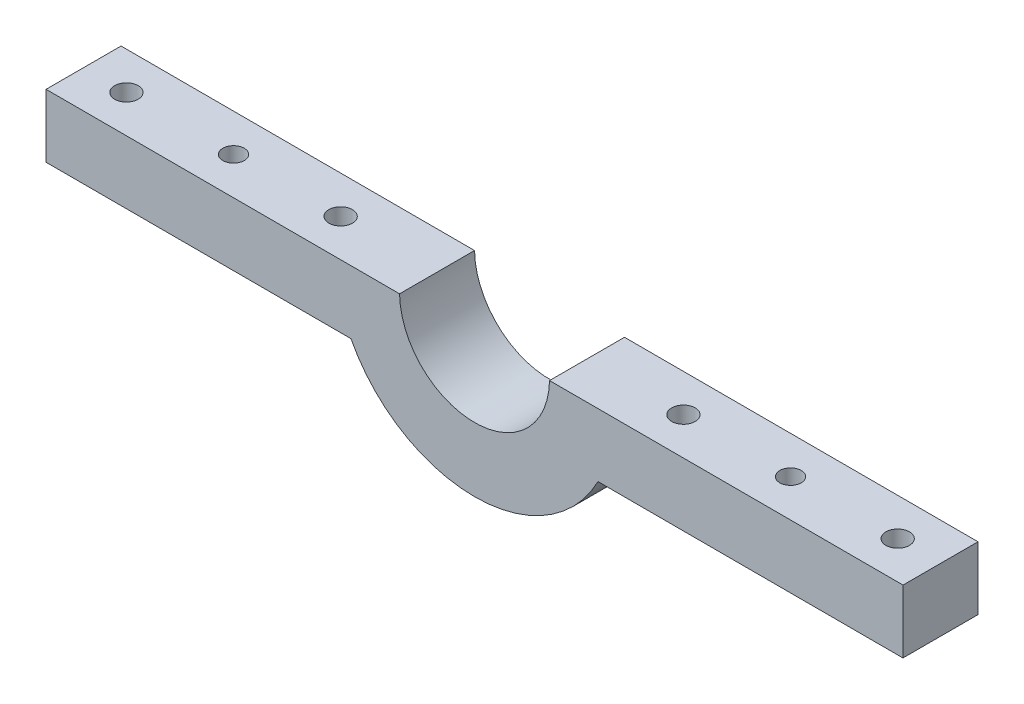
ISO-10303-21;
HEADER;
FILE_DESCRIPTION(('STEP AP214'),'2;1');
FILE_NAME('part.step','',(''),(''),'','','');
FILE_SCHEMA(('AUTOMOTIVE_DESIGN { 1 0 10303 214 1 1 1 1 }'));
ENDSEC;
DATA;
#1=APPLICATION_CONTEXT('core data for automotive mechanical design processes');
#2=APPLICATION_PROTOCOL_DEFINITION('international standard','automotive_design',2000,#1);
#3=PRODUCT_CONTEXT('',#1,'mechanical');
#4=PRODUCT('Part','Part','',(#3));
#5=PRODUCT_RELATED_PRODUCT_CATEGORY('part','',(#4));
#6=PRODUCT_DEFINITION_FORMATION('','',#4);
#7=PRODUCT_DEFINITION_CONTEXT('part definition',#1,'design');
#8=PRODUCT_DEFINITION('design','',#6,#7);
#9=PRODUCT_DEFINITION_SHAPE('','',#8);
#10=(LENGTH_UNIT() NAMED_UNIT(*) SI_UNIT(.MILLI.,.METRE.));
#11=(NAMED_UNIT(*) PLANE_ANGLE_UNIT() SI_UNIT($,.RADIAN.));
#12=(NAMED_UNIT(*) SI_UNIT($,.STERADIAN.) SOLID_ANGLE_UNIT());
#13=UNCERTAINTY_MEASURE_WITH_UNIT(LENGTH_MEASURE(1.E-05),#10,'distance_accuracy_value','');
#14=(GEOMETRIC_REPRESENTATION_CONTEXT(3) GLOBAL_UNCERTAINTY_ASSIGNED_CONTEXT((#13)) GLOBAL_UNIT_ASSIGNED_CONTEXT((#10,
#11,#12)) REPRESENTATION_CONTEXT('',''));
#15=CARTESIAN_POINT('',(0.,0.,0.));
#16=DIRECTION('',(0.,0.,1.));
#17=DIRECTION('',(1.,0.,0.));
#18=AXIS2_PLACEMENT_3D('',#15,#16,#17);
#19=CARTESIAN_POINT('',(-200.026923904211,-269.609117302234,-35.));
#20=DIRECTION('',(-0.999999508293016,0.00099167218711209,0.));
#21=DIRECTION('',(-0.00099167218711209,-0.999999508293016,0.));
#22=AXIS2_PLACEMENT_3D('',#19,#20,#21);
#23=PLANE('',#22);
#24=DIRECTION('',(-0.00099167218711209,-0.999999508293016,0.));
#25=VECTOR('',#24,1.);
#26=CARTESIAN_POINT('',(-200.026923904211,-269.609117302234,0.));
#27=LINE('',#26,#25);
#28=CARTESIAN_POINT('',(-199.997669574691,-240.10913180759,0.));
#29=VERTEX_POINT('',#28);
#30=CARTESIAN_POINT('',(-200.026923904211,-269.609117302234,0.));
#31=VERTEX_POINT('',#30);
#32=EDGE_CURVE('E137',#29,#31,#27,.T.);
#33=ORIENTED_EDGE('',*,*,#32,.F.);
#34=DIRECTION('',(0.,0.,1.));
#35=VECTOR('',#34,1.);
#36=CARTESIAN_POINT('',(-199.997669574691,-240.10913180759,-35.));
#37=LINE('',#36,#35);
#38=CARTESIAN_POINT('',(-199.997669574691,-240.10913180759,-35.));
#39=VERTEX_POINT('',#38);
#40=EDGE_CURVE('E11',#39,#29,#37,.T.);
#41=ORIENTED_EDGE('',*,*,#40,.F.);
#42=DIRECTION('',(-0.00099167218711209,-0.999999508293016,0.));
#43=VECTOR('',#42,1.);
#44=CARTESIAN_POINT('',(-200.026923904211,-269.609117302234,-35.));
#45=LINE('',#44,#43);
#46=CARTESIAN_POINT('',(-200.026923904211,-269.609117302234,-35.));
#47=VERTEX_POINT('',#46);
#48=EDGE_CURVE('E158',#39,#47,#45,.T.);
#49=ORIENTED_EDGE('',*,*,#48,.T.);
#50=DIRECTION('',(0.,0.,1.));
#51=VECTOR('',#50,1.);
#52=CARTESIAN_POINT('',(-200.026923904211,-269.609117302234,-35.));
#53=LINE('',#52,#51);
#54=EDGE_CURVE('E95',#47,#31,#53,.T.);
#55=ORIENTED_EDGE('',*,*,#54,.T.);
#56=EDGE_LOOP('',(#33,#41,#49,#55));
#57=FACE_BOUND('',#56,.T.);
#58=ADVANCED_FACE('F39',(#57),#23,.T.);
#59=CARTESIAN_POINT('',(-199.997669574691,-240.10913180759,-35.));
#60=DIRECTION('',(0.000991672187112087,0.999999508293016,0.));
#61=DIRECTION('',(-0.999999508293016,0.000991672187112087,0.));
#62=AXIS2_PLACEMENT_3D('',#59,#60,#61);
#63=PLANE('',#62);
#64=CARTESIAN_POINT('',(-129.99770399418,-240.178548860687,-17.5));
#65=DIRECTION('',(0.000991672187112087,0.999999508293016,0.));
#66=DIRECTION('',(-0.999999508293016,0.000991672187112087,0.));
#67=AXIS2_PLACEMENT_3D('',#64,#65,#66);
#68=CIRCLE('',#67,4.99999999999999);
#69=CARTESIAN_POINT('',(-134.997701535645,-240.173590499752,-17.5));
#70=VERTEX_POINT('',#69);
#71=EDGE_CURVE('E178',#70,#70,#68,.T.);
#72=ORIENTED_EDGE('',*,*,#71,.F.);
#73=EDGE_LOOP('',(#72));
#74=FACE_BOUND('',#73,.T.);
#75=CARTESIAN_POINT('',(-179.997679408831,-240.128965251332,-17.5));
#76=DIRECTION('',(0.000991672187112085,0.999999508293016,0.));
#77=DIRECTION('',(-0.999999508293016,0.000991672187112085,0.));
#78=AXIS2_PLACEMENT_3D('',#75,#76,#77);
#79=CIRCLE('',#78,5.49999999999999);
#80=CARTESIAN_POINT('',(-185.497676704442,-240.123511054303,-17.5));
#81=VERTEX_POINT('',#80);
#82=EDGE_CURVE('E175',#81,#81,#79,.T.);
#83=ORIENTED_EDGE('',*,*,#82,.F.);
#84=EDGE_LOOP('',(#83));
#85=FACE_BOUND('',#84,.T.);
#86=CARTESIAN_POINT('',(-79.9977285795291,-240.228132470043,-17.5));
#87=DIRECTION('',(0.000991672187112085,0.999999508293016,0.));
#88=DIRECTION('',(-0.999999508293016,0.000991672187112085,0.));
#89=AXIS2_PLACEMENT_3D('',#86,#87,#88);
#90=CIRCLE('',#89,5.49999999999999);
#91=CARTESIAN_POINT('',(-85.4977258751407,-240.222678273014,-17.5));
#92=VERTEX_POINT('',#91);
#93=EDGE_CURVE('E174',#92,#92,#90,.T.);
#94=ORIENTED_EDGE('',*,*,#93,.F.);
#95=EDGE_LOOP('',(#94));
#96=FACE_BOUND('',#95,.T.);
#97=DIRECTION('',(-0.999999508293016,0.000991672187112086,0.));
#98=VECTOR('',#97,1.);
#99=CARTESIAN_POINT('',(-199.997669574691,-240.10913180759,0.));
#100=LINE('',#99,#98);
#101=CARTESIAN_POINT('',(-34.9941790972939,-240.27276126033,0.));
#102=VERTEX_POINT('',#101);
#103=EDGE_CURVE('E156',#102,#29,#100,.T.);
#104=ORIENTED_EDGE('',*,*,#103,.F.);
#105=DIRECTION('',(0.,0.,1.));
#106=VECTOR('',#105,1.);
#107=CARTESIAN_POINT('',(-34.9941790972939,-240.27276126033,-35.));
#108=LINE('',#107,#106);
#109=CARTESIAN_POINT('',(-34.9941790972939,-240.27276126033,-35.));
#110=VERTEX_POINT('',#109);
#111=EDGE_CURVE('E48',#110,#102,#108,.T.);
#112=ORIENTED_EDGE('',*,*,#111,.F.);
#113=DIRECTION('',(-0.999999508293016,0.000991672187112086,0.));
#114=VECTOR('',#113,1.);
#115=CARTESIAN_POINT('',(-199.997669574691,-240.10913180759,-35.));
#116=LINE('',#115,#114);
#117=EDGE_CURVE('E127',#110,#39,#116,.T.);
#118=ORIENTED_EDGE('',*,*,#117,.T.);
#119=ORIENTED_EDGE('',*,*,#40,.T.);
#120=EDGE_LOOP('',(#104,#112,#118,#119));
#121=FACE_BOUND('',#120,.T.);
#122=ADVANCED_FACE('F229',(#74,#85,#96,#121),#63,.T.);
#123=CARTESIAN_POINT('',(0.00272792000566536,-239.807466490866,-35.));
#124=DIRECTION('',(0.,0.,1.));
#125=DIRECTION('',(1.,0.,0.));
#126=AXIS2_PLACEMENT_3D('',#123,#124,#125);
#127=CYLINDRICAL_SURFACE('',#126,35.);
#128=CARTESIAN_POINT('',(0.00272792000566536,-239.807466490866,0.));
#129=DIRECTION('',(0.,0.,-1.));
#130=DIRECTION('',(1.,0.,0.));
#131=AXIS2_PLACEMENT_3D('',#128,#129,#130);
#132=CIRCLE('',#131,35.);
#133=CARTESIAN_POINT('',(34.9986432651181,-240.342171229694,0.));
#134=VERTEX_POINT('',#133);
#135=EDGE_CURVE('E114',#134,#102,#132,.T.);
#136=ORIENTED_EDGE('',*,*,#135,.F.);
#137=DIRECTION('',(0.,0.,1.));
#138=VECTOR('',#137,1.);
#139=CARTESIAN_POINT('',(34.9986432651181,-240.342171229694,-35.));
#140=LINE('',#139,#138);
#141=CARTESIAN_POINT('',(34.9986432651181,-240.342171229694,-35.));
#142=VERTEX_POINT('',#141);
#143=EDGE_CURVE('E109',#142,#134,#140,.T.);
#144=ORIENTED_EDGE('',*,*,#143,.F.);
#145=CARTESIAN_POINT('',(0.00272792000566536,-239.807466490866,-35.));
#146=DIRECTION('',(0.,0.,-1.));
#147=DIRECTION('',(1.,0.,0.));
#148=AXIS2_PLACEMENT_3D('',#145,#146,#147);
#149=CIRCLE('',#148,35.);
#150=EDGE_CURVE('E112',#142,#110,#149,.T.);
#151=ORIENTED_EDGE('',*,*,#150,.T.);
#152=ORIENTED_EDGE('',*,*,#111,.T.);
#153=EDGE_LOOP('',(#136,#144,#151,#152));
#154=FACE_BOUND('',#153,.T.);
#155=ADVANCED_FACE('F111',(#154),#127,.F.);
#156=CARTESIAN_POINT('',(34.9986432651181,-240.342171229694,-35.));
#157=DIRECTION('',(0.000991672187112086,0.999999508293016,0.));
#158=DIRECTION('',(-0.999999508293016,0.000991672187112086,0.));
#159=AXIS2_PLACEMENT_3D('',#156,#157,#158);
#160=PLANE('',#159);
#161=CARTESIAN_POINT('',(130.002168162004,-240.436383629337,-17.5));
#162=DIRECTION('',(0.000991672187112086,0.999999508293016,0.));
#163=DIRECTION('',(-0.999999508293016,0.000991672187112086,0.));
#164=AXIS2_PLACEMENT_3D('',#161,#162,#163);
#165=CIRCLE('',#164,4.99999999999999);
#166=CARTESIAN_POINT('',(125.002170620539,-240.431425268401,-17.5));
#167=VERTEX_POINT('',#166);
#168=EDGE_CURVE('E183',#167,#167,#165,.T.);
#169=ORIENTED_EDGE('',*,*,#168,.F.);
#170=EDGE_LOOP('',(#169));
#171=FACE_BOUND('',#170,.T.);
#172=CARTESIAN_POINT('',(80.0021927473534,-240.386800019981,-17.5));
#173=DIRECTION('',(0.000991672187112085,0.999999508293016,0.));
#174=DIRECTION('',(-0.999999508293016,0.000991672187112085,0.));
#175=AXIS2_PLACEMENT_3D('',#172,#173,#174);
#176=CIRCLE('',#175,5.49999999999999);
#177=CARTESIAN_POINT('',(74.5021954517418,-240.381345822952,-17.5));
#178=VERTEX_POINT('',#177);
#179=EDGE_CURVE('E203',#178,#178,#176,.T.);
#180=ORIENTED_EDGE('',*,*,#179,.F.);
#181=EDGE_LOOP('',(#180));
#182=FACE_BOUND('',#181,.T.);
#183=CARTESIAN_POINT('',(180.002143576655,-240.485967238692,-17.5));
#184=DIRECTION('',(0.000991672187112085,0.999999508293016,0.));
#185=DIRECTION('',(-0.999999508293016,0.000991672187112085,0.));
#186=AXIS2_PLACEMENT_3D('',#183,#184,#185);
#187=CIRCLE('',#186,5.49999999999999);
#188=CARTESIAN_POINT('',(174.502146281043,-240.480513041663,-17.5));
#189=VERTEX_POINT('',#188);
#190=EDGE_CURVE('E171',#189,#189,#187,.T.);
#191=ORIENTED_EDGE('',*,*,#190,.F.);
#192=EDGE_LOOP('',(#191));
#193=FACE_BOUND('',#192,.T.);
#194=DIRECTION('',(-0.999999508293016,0.000991672187112086,0.));
#195=VECTOR('',#194,1.);
#196=CARTESIAN_POINT('',(34.9986432651181,-240.342171229694,0.));
#197=LINE('',#196,#195);
#198=CARTESIAN_POINT('',(200.002133742515,-240.505800682434,0.));
#199=VERTEX_POINT('',#198);
#200=EDGE_CURVE('E153',#199,#134,#197,.T.);
#201=ORIENTED_EDGE('',*,*,#200,.F.);
#202=DIRECTION('',(0.,0.,1.));
#203=VECTOR('',#202,1.);
#204=CARTESIAN_POINT('',(200.002133742515,-240.505800682434,-35.));
#205=LINE('',#204,#203);
#206=CARTESIAN_POINT('',(200.002133742515,-240.505800682434,-35.));
#207=VERTEX_POINT('',#206);
#208=EDGE_CURVE('E119',#207,#199,#205,.T.);
#209=ORIENTED_EDGE('',*,*,#208,.F.);
#210=DIRECTION('',(-0.999999508293016,0.000991672187112086,0.));
#211=VECTOR('',#210,1.);
#212=CARTESIAN_POINT('',(34.9986432651181,-240.342171229694,-35.));
#213=LINE('',#212,#211);
#214=EDGE_CURVE('E125',#207,#142,#213,.T.);
#215=ORIENTED_EDGE('',*,*,#214,.T.);
#216=ORIENTED_EDGE('',*,*,#143,.T.);
#217=EDGE_LOOP('',(#201,#209,#215,#216));
#218=FACE_BOUND('',#217,.T.);
#219=ADVANCED_FACE('F129',(#171,#182,#193,#218),#160,.T.);
#220=CARTESIAN_POINT('',(200.002133742515,-240.505800682434,-35.));
#221=DIRECTION('',(0.999999508293016,-0.00099167218711209,0.));
#222=DIRECTION('',(0.00099167218711209,0.999999508293016,0.));
#223=AXIS2_PLACEMENT_3D('',#220,#221,#222);
#224=PLANE('',#223);
#225=DIRECTION('',(0.00099167218711209,0.999999508293016,0.));
#226=VECTOR('',#225,1.);
#227=CARTESIAN_POINT('',(200.002133742515,-240.505800682434,0.));
#228=LINE('',#227,#226);
#229=CARTESIAN_POINT('',(199.972879412995,-270.005786177078,0.));
#230=VERTEX_POINT('',#229);
#231=EDGE_CURVE('E150',#230,#199,#228,.T.);
#232=ORIENTED_EDGE('',*,*,#231,.F.);
#233=DIRECTION('',(0.,0.,1.));
#234=VECTOR('',#233,1.);
#235=CARTESIAN_POINT('',(199.972879412995,-270.005786177078,-35.));
#236=LINE('',#235,#234);
#237=CARTESIAN_POINT('',(199.972879412995,-270.005786177078,-35.));
#238=VERTEX_POINT('',#237);
#239=EDGE_CURVE('E162',#238,#230,#236,.T.);
#240=ORIENTED_EDGE('',*,*,#239,.F.);
#241=DIRECTION('',(0.00099167218711209,0.999999508293016,0.));
#242=VECTOR('',#241,1.);
#243=CARTESIAN_POINT('',(200.002133742515,-240.505800682434,-35.));
#244=LINE('',#243,#242);
#245=EDGE_CURVE('E130',#238,#207,#244,.T.);
#246=ORIENTED_EDGE('',*,*,#245,.T.);
#247=ORIENTED_EDGE('',*,*,#208,.T.);
#248=EDGE_LOOP('',(#232,#240,#246,#247));
#249=FACE_BOUND('',#248,.T.);
#250=ADVANCED_FACE('F245',(#249),#224,.T.);
#251=CARTESIAN_POINT('',(199.972879412995,-270.005786177078,-35.));
#252=DIRECTION('',(-0.000991672187112033,-0.999999508293016,0.));
#253=DIRECTION('',(0.999999508293016,-0.000991672187112033,0.));
#254=AXIS2_PLACEMENT_3D('',#251,#252,#253);
#255=PLANE('',#254);
#256=CARTESIAN_POINT('',(129.972913832484,-269.936369123981,-17.5));
#257=DIRECTION('',(-0.000991672187112031,-0.999999508293016,0.));
#258=DIRECTION('',(0.999999508293016,-0.000991672187112031,0.));
#259=AXIS2_PLACEMENT_3D('',#256,#257,#258);
#260=CIRCLE('',#259,5.49999999999999);
#261=CARTESIAN_POINT('',(135.472911128096,-269.94182332101,-17.5));
#262=VERTEX_POINT('',#261);
#263=EDGE_CURVE('E186',#262,#262,#260,.T.);
#264=ORIENTED_EDGE('',*,*,#263,.F.);
#265=EDGE_LOOP('',(#264));
#266=FACE_BOUND('',#265,.T.);
#267=CARTESIAN_POINT('',(79.9729384178336,-269.886785514625,-17.5));
#268=DIRECTION('',(-0.000991672187112033,-0.999999508293016,0.));
#269=DIRECTION('',(0.999999508293016,-0.000991672187112033,0.));
#270=AXIS2_PLACEMENT_3D('',#267,#268,#269);
#271=CIRCLE('',#270,5.49999999999999);
#272=CARTESIAN_POINT('',(85.4729357134452,-269.892239711654,-17.5));
#273=VERTEX_POINT('',#272);
#274=EDGE_CURVE('E206',#273,#273,#271,.T.);
#275=ORIENTED_EDGE('',*,*,#274,.F.);
#276=EDGE_LOOP('',(#275));
#277=FACE_BOUND('',#276,.T.);
#278=CARTESIAN_POINT('',(179.972889247135,-269.985952733336,-17.5));
#279=DIRECTION('',(-0.000991672187112033,-0.999999508293016,0.));
#280=DIRECTION('',(0.999999508293016,-0.000991672187112033,0.));
#281=AXIS2_PLACEMENT_3D('',#278,#279,#280);
#282=CIRCLE('',#281,5.49999999999999);
#283=CARTESIAN_POINT('',(185.472886542747,-269.991406930365,-17.5));
#284=VERTEX_POINT('',#283);
#285=EDGE_CURVE('E141',#284,#284,#282,.T.);
#286=ORIENTED_EDGE('',*,*,#285,.F.);
#287=EDGE_LOOP('',(#286));
#288=FACE_BOUND('',#287,.T.);
#289=DIRECTION('',(0.999999508293016,-0.000991672187112033,0.));
#290=VECTOR('',#289,1.);
#291=CARTESIAN_POINT('',(199.972879412995,-270.005786177078,0.));
#292=LINE('',#291,#290);
#293=CARTESIAN_POINT('',(57.6357623745385,-269.864634347512,0.));
#294=VERTEX_POINT('',#293);
#295=EDGE_CURVE('E147',#294,#230,#292,.T.);
#296=ORIENTED_EDGE('',*,*,#295,.F.);
#297=DIRECTION('',(0.,0.,1.));
#298=VECTOR('',#297,1.);
#299=CARTESIAN_POINT('',(57.6357623745385,-269.864634347512,-35.));
#300=LINE('',#299,#298);
#301=CARTESIAN_POINT('',(57.6357623745385,-269.864634347512,-35.));
#302=VERTEX_POINT('',#301);
#303=EDGE_CURVE('E164',#302,#294,#300,.T.);
#304=ORIENTED_EDGE('',*,*,#303,.F.);
#305=DIRECTION('',(0.999999508293016,-0.000991672187112033,0.));
#306=VECTOR('',#305,1.);
#307=CARTESIAN_POINT('',(199.972879412995,-270.005786177078,-35.));
#308=LINE('',#307,#306);
#309=EDGE_CURVE('E132',#302,#238,#308,.T.);
#310=ORIENTED_EDGE('',*,*,#309,.T.);
#311=ORIENTED_EDGE('',*,*,#239,.T.);
#312=EDGE_LOOP('',(#296,#304,#310,#311));
#313=FACE_BOUND('',#312,.T.);
#314=ADVANCED_FACE('F220',(#266,#277,#288,#313),#255,.T.);
#315=CARTESIAN_POINT('',(0.00272792000566536,-239.807466490866,-35.));
#316=DIRECTION('',(0.,0.,1.));
#317=DIRECTION('',(1.,0.,0.));
#318=AXIS2_PLACEMENT_3D('',#315,#316,#317);
#319=CYLINDRICAL_SURFACE('',#318,65.);
#320=CARTESIAN_POINT('',(0.00272792000566536,-239.807466490866,0.));
#321=DIRECTION('',(0.,0.,1.));
#322=DIRECTION('',(1.,0.,0.));
#323=AXIS2_PLACEMENT_3D('',#320,#321,#322);
#324=CIRCLE('',#323,65.);
#325=CARTESIAN_POINT('',(-57.6898068657538,-269.7502691318,0.));
#326=VERTEX_POINT('',#325);
#327=EDGE_CURVE('E144',#326,#294,#324,.T.);
#328=ORIENTED_EDGE('',*,*,#327,.F.);
#329=DIRECTION('',(0.,0.,1.));
#330=VECTOR('',#329,1.);
#331=CARTESIAN_POINT('',(-57.6898068657538,-269.7502691318,-35.));
#332=LINE('',#331,#330);
#333=CARTESIAN_POINT('',(-57.6898068657538,-269.7502691318,-35.));
#334=VERTEX_POINT('',#333);
#335=EDGE_CURVE('E166',#334,#326,#332,.T.);
#336=ORIENTED_EDGE('',*,*,#335,.F.);
#337=CARTESIAN_POINT('',(0.00272792000566536,-239.807466490866,-35.));
#338=DIRECTION('',(0.,0.,1.));
#339=DIRECTION('',(1.,0.,0.));
#340=AXIS2_PLACEMENT_3D('',#337,#338,#339);
#341=CIRCLE('',#340,65.);
#342=EDGE_CURVE('E214',#334,#302,#341,.T.);
#343=ORIENTED_EDGE('',*,*,#342,.T.);
#344=ORIENTED_EDGE('',*,*,#303,.T.);
#345=EDGE_LOOP('',(#328,#336,#343,#344));
#346=FACE_BOUND('',#345,.T.);
#347=ADVANCED_FACE('F225',(#346),#319,.T.);
#348=CARTESIAN_POINT('',(-57.6898068657538,-269.7502691318,-35.));
#349=DIRECTION('',(-0.000991672187112033,-0.999999508293016,0.));
#350=DIRECTION('',(0.999999508293016,-0.000991672187112033,0.));
#351=AXIS2_PLACEMENT_3D('',#348,#349,#350);
#352=PLANE('',#351);
#353=CARTESIAN_POINT('',(-130.0269583237,-269.678534355332,-17.5));
#354=DIRECTION('',(-0.000991672187112031,-0.999999508293016,0.));
#355=DIRECTION('',(0.999999508293016,-0.000991672187112031,0.));
#356=AXIS2_PLACEMENT_3D('',#353,#354,#355);
#357=CIRCLE('',#356,5.49999999999999);
#358=CARTESIAN_POINT('',(-124.526961028088,-269.683988552361,-17.5));
#359=VERTEX_POINT('',#358);
#360=EDGE_CURVE('E262',#359,#359,#357,.T.);
#361=ORIENTED_EDGE('',*,*,#360,.F.);
#362=EDGE_LOOP('',(#361));
#363=FACE_BOUND('',#362,.T.);
#364=CARTESIAN_POINT('',(-180.026933738351,-269.628950745976,-17.5));
#365=DIRECTION('',(-0.000991672187112033,-0.999999508293016,0.));
#366=DIRECTION('',(0.999999508293016,-0.000991672187112033,0.));
#367=AXIS2_PLACEMENT_3D('',#364,#365,#366);
#368=CIRCLE('',#367,5.49999999999999);
#369=CARTESIAN_POINT('',(-174.526936442739,-269.634404943005,-17.5));
#370=VERTEX_POINT('',#369);
#371=EDGE_CURVE('E172',#370,#370,#368,.T.);
#372=ORIENTED_EDGE('',*,*,#371,.F.);
#373=EDGE_LOOP('',(#372));
#374=FACE_BOUND('',#373,.T.);
#375=CARTESIAN_POINT('',(-80.0269829090489,-269.728117964687,-17.5));
#376=DIRECTION('',(-0.000991672187112033,-0.999999508293016,0.));
#377=DIRECTION('',(0.999999508293016,-0.000991672187112033,0.));
#378=AXIS2_PLACEMENT_3D('',#375,#376,#377);
#379=CIRCLE('',#378,5.49999999999999);
#380=CARTESIAN_POINT('',(-74.5269856134374,-269.733572161716,-17.5));
#381=VERTEX_POINT('',#380);
#382=EDGE_CURVE('E200',#381,#381,#379,.T.);
#383=ORIENTED_EDGE('',*,*,#382,.F.);
#384=EDGE_LOOP('',(#383));
#385=FACE_BOUND('',#384,.T.);
#386=DIRECTION('',(0.999999508293016,-0.000991672187112033,0.));
#387=VECTOR('',#386,1.);
#388=CARTESIAN_POINT('',(-57.6898068657538,-269.7502691318,0.));
#389=LINE('',#388,#387);
#390=EDGE_CURVE('E140',#31,#326,#389,.T.);
#391=ORIENTED_EDGE('',*,*,#390,.F.);
#392=ORIENTED_EDGE('',*,*,#54,.F.);
#393=DIRECTION('',(0.999999508293016,-0.000991672187112033,0.));
#394=VECTOR('',#393,1.);
#395=CARTESIAN_POINT('',(-57.6898068657538,-269.7502691318,-35.));
#396=LINE('',#395,#394);
#397=EDGE_CURVE('E212',#47,#334,#396,.T.);
#398=ORIENTED_EDGE('',*,*,#397,.T.);
#399=ORIENTED_EDGE('',*,*,#335,.T.);
#400=EDGE_LOOP('',(#391,#392,#398,#399));
#401=FACE_BOUND('',#400,.T.);
#402=ADVANCED_FACE('F226',(#363,#374,#385,#401),#352,.T.);
#403=CARTESIAN_POINT('',(0.00272792000566536,-239.807466490866,-35.));
#404=DIRECTION('',(0.,0.,1.));
#405=DIRECTION('',(1.,0.,0.));
#406=AXIS2_PLACEMENT_3D('',#403,#404,#405);
#407=PLANE('',#406);
#408=ORIENTED_EDGE('',*,*,#48,.F.);
#409=ORIENTED_EDGE('',*,*,#117,.F.);
#410=ORIENTED_EDGE('',*,*,#150,.F.);
#411=ORIENTED_EDGE('',*,*,#214,.F.);
#412=ORIENTED_EDGE('',*,*,#245,.F.);
#413=ORIENTED_EDGE('',*,*,#309,.F.);
#414=ORIENTED_EDGE('',*,*,#342,.F.);
#415=ORIENTED_EDGE('',*,*,#397,.F.);
#416=EDGE_LOOP('',(#408,#409,#410,#411,#412,#413,#414,#415));
#417=FACE_BOUND('',#416,.T.);
#418=ADVANCED_FACE('F123',(#417),#407,.F.);
#419=CARTESIAN_POINT('',(0.00272792000566536,-239.807466490866,0.));
#420=DIRECTION('',(0.,0.,1.));
#421=DIRECTION('',(1.,0.,0.));
#422=AXIS2_PLACEMENT_3D('',#419,#420,#421);
#423=PLANE('',#422);
#424=ORIENTED_EDGE('',*,*,#32,.T.);
#425=ORIENTED_EDGE('',*,*,#390,.T.);
#426=ORIENTED_EDGE('',*,*,#327,.T.);
#427=ORIENTED_EDGE('',*,*,#295,.T.);
#428=ORIENTED_EDGE('',*,*,#231,.T.);
#429=ORIENTED_EDGE('',*,*,#200,.T.);
#430=ORIENTED_EDGE('',*,*,#135,.T.);
#431=ORIENTED_EDGE('',*,*,#103,.T.);
#432=EDGE_LOOP('',(#424,#425,#426,#427,#428,#429,#430,#431));
#433=FACE_BOUND('',#432,.T.);
#434=ADVANCED_FACE('F228',(#433),#423,.T.);
#435=CARTESIAN_POINT('',(180.002143576655,-240.485967238692,-17.5));
#436=DIRECTION('',(0.000991672187112085,0.999999508293016,0.));
#437=DIRECTION('',(-0.999999508293016,0.000991672187112085,0.));
#438=AXIS2_PLACEMENT_3D('',#435,#436,#437);
#439=CYLINDRICAL_SURFACE('',#438,5.49999999999999);
#440=ORIENTED_EDGE('',*,*,#285,.T.);
#441=EDGE_LOOP('',(#440));
#442=FACE_BOUND('',#441,.T.);
#443=ORIENTED_EDGE('',*,*,#190,.T.);
#444=EDGE_LOOP('',(#443));
#445=FACE_BOUND('',#444,.T.);
#446=ADVANCED_FACE('F282',(#442,#445),#439,.F.);
#447=CARTESIAN_POINT('',(80.0021927473534,-240.386800019981,-17.5));
#448=DIRECTION('',(0.000991672187112085,0.999999508293016,0.));
#449=DIRECTION('',(-0.999999508293016,0.000991672187112085,0.));
#450=AXIS2_PLACEMENT_3D('',#447,#448,#449);
#451=CYLINDRICAL_SURFACE('',#450,5.49999999999999);
#452=ORIENTED_EDGE('',*,*,#274,.T.);
#453=EDGE_LOOP('',(#452));
#454=FACE_BOUND('',#453,.T.);
#455=ORIENTED_EDGE('',*,*,#179,.T.);
#456=EDGE_LOOP('',(#455));
#457=FACE_BOUND('',#456,.T.);
#458=ADVANCED_FACE('F271',(#454,#457),#451,.F.);
#459=CARTESIAN_POINT('',(-79.9977285795291,-240.228132470043,-17.5));
#460=DIRECTION('',(0.000991672187112085,0.999999508293016,0.));
#461=DIRECTION('',(-0.999999508293016,0.000991672187112085,0.));
#462=AXIS2_PLACEMENT_3D('',#459,#460,#461);
#463=CYLINDRICAL_SURFACE('',#462,5.49999999999999);
#464=ORIENTED_EDGE('',*,*,#382,.T.);
#465=EDGE_LOOP('',(#464));
#466=FACE_BOUND('',#465,.T.);
#467=ORIENTED_EDGE('',*,*,#93,.T.);
#468=EDGE_LOOP('',(#467));
#469=FACE_BOUND('',#468,.T.);
#470=ADVANCED_FACE('F267',(#466,#469),#463,.F.);
#471=CARTESIAN_POINT('',(-179.997679408831,-240.128965251332,-17.5));
#472=DIRECTION('',(0.000991672187112085,0.999999508293016,0.));
#473=DIRECTION('',(-0.999999508293016,0.000991672187112085,0.));
#474=AXIS2_PLACEMENT_3D('',#471,#472,#473);
#475=CYLINDRICAL_SURFACE('',#474,5.49999999999999);
#476=ORIENTED_EDGE('',*,*,#371,.T.);
#477=EDGE_LOOP('',(#476));
#478=FACE_BOUND('',#477,.T.);
#479=ORIENTED_EDGE('',*,*,#82,.T.);
#480=EDGE_LOOP('',(#479));
#481=FACE_BOUND('',#480,.T.);
#482=ADVANCED_FACE('F270',(#478,#481),#475,.F.);
#483=CARTESIAN_POINT('',(129.972913832484,-269.936369123981,-17.5));
#484=DIRECTION('',(-0.000991672187112031,-0.999999508293016,0.));
#485=DIRECTION('',(0.999999508293016,-0.000991672187112031,0.));
#486=AXIS2_PLACEMENT_3D('',#483,#484,#485);
#487=CYLINDRICAL_SURFACE('',#486,4.99999999999999);
#488=CARTESIAN_POINT('',(129.983128482738,-259.63594387926,-17.5));
#489=DIRECTION('',(-0.000991672187112031,-0.999999508293016,0.));
#490=DIRECTION('',(0.999999508293016,-0.000991672187112031,0.));
#491=AXIS2_PLACEMENT_3D('',#488,#489,#490);
#492=CIRCLE('',#491,4.99999999999999);
#493=CARTESIAN_POINT('',(134.983126024203,-259.640902240196,-17.5));
#494=VERTEX_POINT('',#493);
#495=EDGE_CURVE('E176',#494,#494,#492,.T.);
#496=ORIENTED_EDGE('',*,*,#495,.T.);
#497=EDGE_LOOP('',(#496));
#498=FACE_BOUND('',#497,.T.);
#499=ORIENTED_EDGE('',*,*,#168,.T.);
#500=EDGE_LOOP('',(#499));
#501=FACE_BOUND('',#500,.T.);
#502=ADVANCED_FACE('F279',(#498,#501),#487,.F.);
#503=CARTESIAN_POINT('',(-130.0269583237,-269.678534355332,-17.5));
#504=DIRECTION('',(-0.000991672187112031,-0.999999508293016,0.));
#505=DIRECTION('',(0.999999508293016,-0.000991672187112031,0.));
#506=AXIS2_PLACEMENT_3D('',#503,#504,#505);
#507=CYLINDRICAL_SURFACE('',#506,4.99999999999999);
#508=CARTESIAN_POINT('',(-130.016743673447,-259.378109110611,-17.5));
#509=DIRECTION('',(-0.000991672187112031,-0.999999508293016,0.));
#510=DIRECTION('',(0.999999508293016,-0.000991672187112031,0.));
#511=AXIS2_PLACEMENT_3D('',#508,#509,#510);
#512=CIRCLE('',#511,4.99999999999999);
#513=CARTESIAN_POINT('',(-125.016746131981,-259.383067471547,-17.5));
#514=VERTEX_POINT('',#513);
#515=EDGE_CURVE('E42',#514,#514,#512,.T.);
#516=ORIENTED_EDGE('',*,*,#515,.T.);
#517=EDGE_LOOP('',(#516));
#518=FACE_BOUND('',#517,.T.);
#519=ORIENTED_EDGE('',*,*,#71,.T.);
#520=EDGE_LOOP('',(#519));
#521=FACE_BOUND('',#520,.T.);
#522=ADVANCED_FACE('F340',(#518,#521),#507,.F.);
#523=CARTESIAN_POINT('',(129.982830554356,-259.93637404105,-17.5));
#524=DIRECTION('',(-0.000991672187112031,-0.999999508293016,0.));
#525=DIRECTION('',(0.999999508293016,-0.000991672187112031,0.));
#526=AXIS2_PLACEMENT_3D('',#523,#524,#525);
#527=CONICAL_SURFACE('',#526,5.49999999999999,1.02974425867665);
#528=CARTESIAN_POINT('',(129.982830554356,-259.93637404105,-17.5));
#529=DIRECTION('',(-0.000991672187112031,-0.999999508293016,0.));
#530=DIRECTION('',(0.999999508293016,-0.000991672187112031,0.));
#531=AXIS2_PLACEMENT_3D('',#528,#529,#530);
#532=CIRCLE('',#531,5.49999999999999);
#533=CARTESIAN_POINT('',(135.482827849967,-259.94182823808,-17.5));
#534=VERTEX_POINT('',#533);
#535=EDGE_CURVE('E179',#534,#534,#532,.T.);
#536=ORIENTED_EDGE('',*,*,#535,.T.);
#537=EDGE_LOOP('',(#536));
#538=FACE_BOUND('',#537,.T.);
#539=ORIENTED_EDGE('',*,*,#495,.F.);
#540=EDGE_LOOP('',(#539));
#541=FACE_BOUND('',#540,.T.);
#542=ADVANCED_FACE('F346',(#538,#541),#527,.F.);
#543=CARTESIAN_POINT('',(129.972913832484,-269.936369123981,-17.5));
#544=DIRECTION('',(-0.000991672187112031,-0.999999508293016,0.));
#545=DIRECTION('',(0.999999508293016,-0.000991672187112031,0.));
#546=AXIS2_PLACEMENT_3D('',#543,#544,#545);
#547=CYLINDRICAL_SURFACE('',#546,5.49999999999999);
#548=ORIENTED_EDGE('',*,*,#535,.F.);
#549=EDGE_LOOP('',(#548));
#550=FACE_BOUND('',#549,.T.);
#551=ORIENTED_EDGE('',*,*,#263,.T.);
#552=EDGE_LOOP('',(#551));
#553=FACE_BOUND('',#552,.T.);
#554=ADVANCED_FACE('F428',(#550,#553),#547,.F.);
#555=CARTESIAN_POINT('',(-130.017041601829,-259.678539272401,-17.5));
#556=DIRECTION('',(-0.000991672187112031,-0.999999508293016,0.));
#557=DIRECTION('',(0.999999508293016,-0.000991672187112031,0.));
#558=AXIS2_PLACEMENT_3D('',#555,#556,#557);
#559=CONICAL_SURFACE('',#558,5.49999999999999,1.02974425867665);
#560=CARTESIAN_POINT('',(-130.017041601829,-259.678539272401,-17.5));
#561=DIRECTION('',(-0.000991672187112031,-0.999999508293016,0.));
#562=DIRECTION('',(0.999999508293016,-0.000991672187112031,0.));
#563=AXIS2_PLACEMENT_3D('',#560,#561,#562);
#564=CIRCLE('',#563,5.49999999999999);
#565=CARTESIAN_POINT('',(-124.517044306217,-259.683993469431,-17.5));
#566=VERTEX_POINT('',#565);
#567=EDGE_CURVE('E464',#566,#566,#564,.T.);
#568=ORIENTED_EDGE('',*,*,#567,.T.);
#569=EDGE_LOOP('',(#568));
#570=FACE_BOUND('',#569,.T.);
#571=ORIENTED_EDGE('',*,*,#515,.F.);
#572=EDGE_LOOP('',(#571));
#573=FACE_BOUND('',#572,.T.);
#574=ADVANCED_FACE('F434',(#570,#573),#559,.F.);
#575=CARTESIAN_POINT('',(-130.0269583237,-269.678534355332,-17.5));
#576=DIRECTION('',(-0.000991672187112031,-0.999999508293016,0.));
#577=DIRECTION('',(0.999999508293016,-0.000991672187112031,0.));
#578=AXIS2_PLACEMENT_3D('',#575,#576,#577);
#579=CYLINDRICAL_SURFACE('',#578,5.49999999999999);
#580=ORIENTED_EDGE('',*,*,#567,.F.);
#581=EDGE_LOOP('',(#580));
#582=FACE_BOUND('',#581,.T.);
#583=ORIENTED_EDGE('',*,*,#360,.T.);
#584=EDGE_LOOP('',(#583));
#585=FACE_BOUND('',#584,.T.);
#586=ADVANCED_FACE('F442',(#582,#585),#579,.F.);
#587=CLOSED_SHELL('',(#58,#122,#155,#219,#250,#314,#347,#402,#418,#434,#446,#458,#470,#482,#502,
#522,#542,#554,#574,#586));
#588=MANIFOLD_SOLID_BREP('B2',#587);
#589=ADVANCED_BREP_SHAPE_REPRESENTATION('',(#18,#588),#14);
#590=SHAPE_DEFINITION_REPRESENTATION(#9,#589);
ENDSEC;
END-ISO-10303-21;
